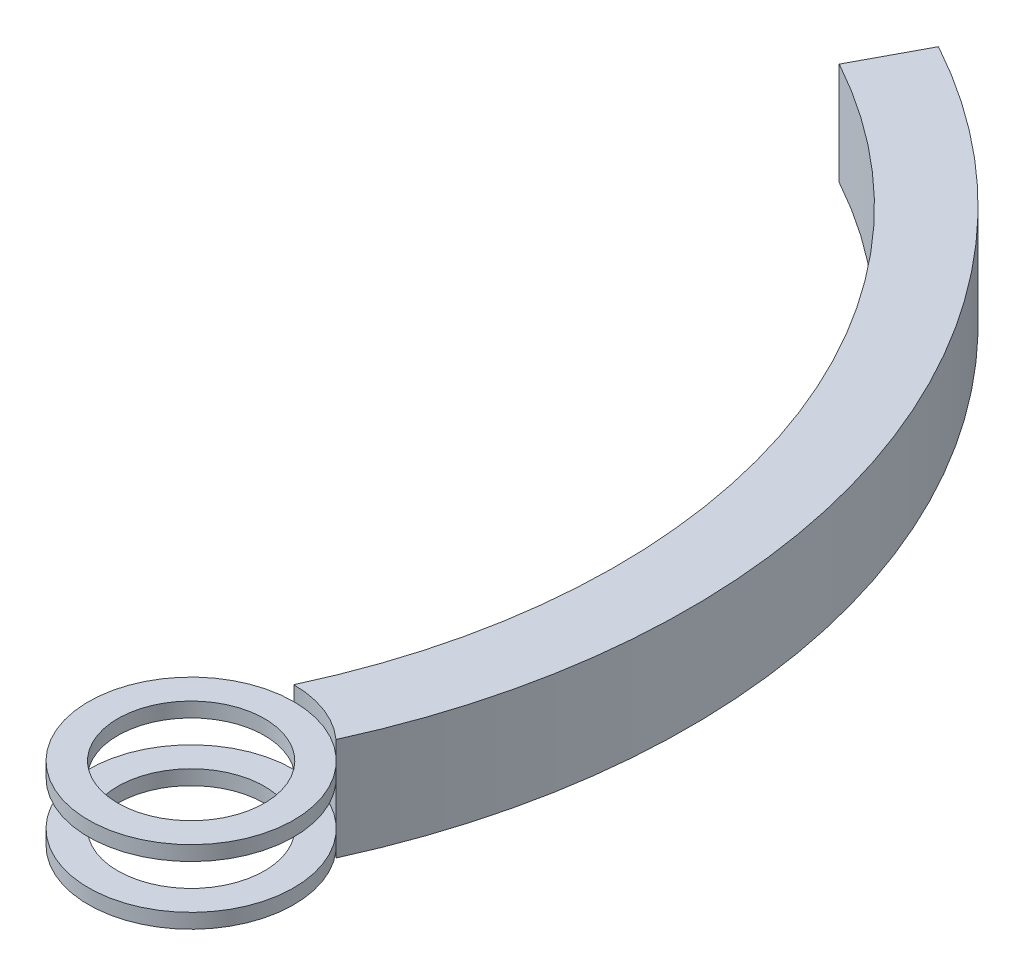
ISO-10303-21;
HEADER;
FILE_DESCRIPTION(('STEP AP214'),'2;1');
FILE_NAME('part.step','',(''),(''),'','','');
FILE_SCHEMA(('AUTOMOTIVE_DESIGN { 1 0 10303 214 1 1 1 1 }'));
ENDSEC;
DATA;
#1=APPLICATION_CONTEXT('core data for automotive mechanical design processes');
#2=APPLICATION_PROTOCOL_DEFINITION('international standard','automotive_design',2000,#1);
#3=PRODUCT_CONTEXT('',#1,'mechanical');
#4=PRODUCT('Part','Part','',(#3));
#5=PRODUCT_RELATED_PRODUCT_CATEGORY('part','',(#4));
#6=PRODUCT_DEFINITION_FORMATION('','',#4);
#7=PRODUCT_DEFINITION_CONTEXT('part definition',#1,'design');
#8=PRODUCT_DEFINITION('design','',#6,#7);
#9=PRODUCT_DEFINITION_SHAPE('','',#8);
#10=(LENGTH_UNIT() NAMED_UNIT(*) SI_UNIT(.MILLI.,.METRE.));
#11=(NAMED_UNIT(*) PLANE_ANGLE_UNIT() SI_UNIT($,.RADIAN.));
#12=(NAMED_UNIT(*) SI_UNIT($,.STERADIAN.) SOLID_ANGLE_UNIT());
#13=UNCERTAINTY_MEASURE_WITH_UNIT(LENGTH_MEASURE(1.E-05),#10,'distance_accuracy_value','');
#14=(GEOMETRIC_REPRESENTATION_CONTEXT(3) GLOBAL_UNCERTAINTY_ASSIGNED_CONTEXT((#13)) GLOBAL_UNIT_ASSIGNED_CONTEXT((#10,
#11,#12)) REPRESENTATION_CONTEXT('',''));
#15=CARTESIAN_POINT('',(0.,0.,0.));
#16=DIRECTION('',(0.,0.,1.));
#17=DIRECTION('',(1.,0.,0.));
#18=AXIS2_PLACEMENT_3D('',#15,#16,#17);
#19=CARTESIAN_POINT('',(9.42486588880634,215.9,-1430.31321434565));
#20=DIRECTION('',(0.,-1.,0.));
#21=DIRECTION('',(0.,0.,-1.));
#22=AXIS2_PLACEMENT_3D('',#19,#20,#21);
#23=CYLINDRICAL_SURFACE('',#22,76.2);
#24=CARTESIAN_POINT('',(9.42486588880634,150.585714285714,-1430.31321434565));
#25=DIRECTION('',(0.,-1.,0.));
#26=DIRECTION('',(0.,0.,-1.));
#27=AXIS2_PLACEMENT_3D('',#24,#25,#26);
#28=CIRCLE('',#27,76.2);
#29=CARTESIAN_POINT('',(60.3625796080155,150.585714285714,-1486.9858649018));
#30=VERTEX_POINT('',#29);
#31=CARTESIAN_POINT('',(9.42486588880628,150.585714285714,-1506.51321434565));
#32=VERTEX_POINT('',#31);
#33=EDGE_CURVE('E126',#30,#32,#28,.T.);
#34=ORIENTED_EDGE('',*,*,#33,.F.);
#35=DIRECTION('',(0.,-1.,0.));
#36=VECTOR('',#35,1.);
#37=CARTESIAN_POINT('',(60.3625796080155,215.9,-1486.9858649018));
#38=LINE('',#37,#36);
#39=CARTESIAN_POINT('',(60.3625796080155,161.471428571429,-1486.9858649018));
#40=VERTEX_POINT('',#39);
#41=EDGE_CURVE('E162',#40,#30,#38,.T.);
#42=ORIENTED_EDGE('',*,*,#41,.F.);
#43=CARTESIAN_POINT('',(9.42486588880634,161.471428571429,-1430.31321434565));
#44=DIRECTION('',(0.,1.,0.));
#45=DIRECTION('',(0.,0.,1.));
#46=AXIS2_PLACEMENT_3D('',#43,#44,#45);
#47=CIRCLE('',#46,76.2);
#48=CARTESIAN_POINT('',(9.42486588880628,161.471428571429,-1506.51321434565));
#49=VERTEX_POINT('',#48);
#50=EDGE_CURVE('E153',#49,#40,#47,.T.);
#51=ORIENTED_EDGE('',*,*,#50,.F.);
#52=DIRECTION('',(0.,-1.,0.));
#53=VECTOR('',#52,1.);
#54=CARTESIAN_POINT('',(9.42486588880631,215.9,-1506.51321434565));
#55=LINE('',#54,#53);
#56=EDGE_CURVE('E148',#49,#32,#55,.T.);
#57=ORIENTED_EDGE('',*,*,#56,.T.);
#58=EDGE_LOOP('',(#34,#42,#51,#57));
#59=FACE_BOUND('',#58,.T.);
#60=ADVANCED_FACE('F35',(#59),#23,.T.);
#61=CARTESIAN_POINT('',(9.42486588880631,205.014285714286,-1506.51321434565));
#62=VERTEX_POINT('',#61);
#63=CARTESIAN_POINT('',(9.42486588880631,194.128571428571,-1506.51321434565));
#64=VERTEX_POINT('',#63);
#65=EDGE_CURVE('E158',#62,#64,#55,.T.);
#66=ORIENTED_EDGE('',*,*,#65,.T.);
#67=CARTESIAN_POINT('',(9.42486588880634,194.128571428571,-1430.31321434565));
#68=DIRECTION('',(0.,1.,0.));
#69=DIRECTION('',(0.,0.,1.));
#70=AXIS2_PLACEMENT_3D('',#67,#68,#69);
#71=CIRCLE('',#70,76.2);
#72=CARTESIAN_POINT('',(60.3625796080155,194.128571428571,-1486.9858649018));
#73=VERTEX_POINT('',#72);
#74=EDGE_CURVE('E180',#64,#73,#71,.T.);
#75=ORIENTED_EDGE('',*,*,#74,.T.);
#76=CARTESIAN_POINT('',(60.3625796080155,205.014285714286,-1486.9858649018));
#77=VERTEX_POINT('',#76);
#78=EDGE_CURVE('E160',#77,#73,#38,.T.);
#79=ORIENTED_EDGE('',*,*,#78,.F.);
#80=CARTESIAN_POINT('',(9.42486588880634,205.014285714286,-1430.31321434565));
#81=DIRECTION('',(0.,1.,0.));
#82=DIRECTION('',(0.,0.,1.));
#83=AXIS2_PLACEMENT_3D('',#80,#81,#82);
#84=CIRCLE('',#83,76.2);
#85=EDGE_CURVE('E182',#62,#77,#84,.T.);
#86=ORIENTED_EDGE('',*,*,#85,.F.);
#87=EDGE_LOOP('',(#66,#75,#79,#86));
#88=FACE_BOUND('',#87,.T.);
#89=ADVANCED_FACE('F177',(#88),#23,.T.);
#90=CARTESIAN_POINT('',(-409.675134111194,215.9,-1702.45607148851));
#91=DIRECTION('',(0.,-1.,0.));
#92=DIRECTION('',(0.,0.,-1.));
#93=AXIS2_PLACEMENT_3D('',#90,#91,#92);
#94=CYLINDRICAL_SURFACE('',#93,517.071428571429);
#95=CARTESIAN_POINT('',(-409.675134111194,139.7,-1702.45607148851));
#96=DIRECTION('',(0.,1.,0.));
#97=DIRECTION('',(0.,0.,1.));
#98=AXIS2_PLACEMENT_3D('',#95,#96,#97);
#99=CIRCLE('',#98,517.071428571429);
#100=CARTESIAN_POINT('',(60.3625796080155,139.7,-1486.9858649018));
#101=VERTEX_POINT('',#100);
#102=CARTESIAN_POINT('',(-161.421062527572,139.7,-2156.03382467648));
#103=VERTEX_POINT('',#102);
#104=EDGE_CURVE('E203',#101,#103,#99,.T.);
#105=ORIENTED_EDGE('',*,*,#104,.T.);
#106=DIRECTION('',(0.,-1.,0.));
#107=VECTOR('',#106,1.);
#108=CARTESIAN_POINT('',(-161.421062527572,215.9,-2156.03382467648));
#109=LINE('',#108,#107);
#110=CARTESIAN_POINT('',(-161.421062527572,215.9,-2156.03382467648));
#111=VERTEX_POINT('',#110);
#112=EDGE_CURVE('E58',#103,#111,#109,.F.);
#113=ORIENTED_EDGE('',*,*,#112,.T.);
#114=CARTESIAN_POINT('',(-409.675134111194,215.9,-1702.45607148851));
#115=DIRECTION('',(0.,1.,0.));
#116=DIRECTION('',(0.,0.,1.));
#117=AXIS2_PLACEMENT_3D('',#114,#115,#116);
#118=CIRCLE('',#117,517.071428571429);
#119=CARTESIAN_POINT('',(60.3625796080155,215.9,-1486.9858649018));
#120=VERTEX_POINT('',#119);
#121=EDGE_CURVE('E205',#120,#111,#118,.T.);
#122=ORIENTED_EDGE('',*,*,#121,.F.);
#123=EDGE_CURVE('E155',#120,#77,#38,.T.);
#124=ORIENTED_EDGE('',*,*,#123,.T.);
#125=ORIENTED_EDGE('',*,*,#78,.T.);
#126=DIRECTION('',(0.,1.,0.));
#127=VECTOR('',#126,1.);
#128=CARTESIAN_POINT('',(60.3625796080155,177.8,-1486.9858649018));
#129=LINE('',#128,#127);
#130=EDGE_CURVE('E193',#73,#40,#129,.F.);
#131=ORIENTED_EDGE('',*,*,#130,.T.);
#132=ORIENTED_EDGE('',*,*,#41,.T.);
#133=DIRECTION('',(0.,-1.,0.));
#134=VECTOR('',#133,1.);
#135=CARTESIAN_POINT('',(60.3625796080155,145.142857142857,-1486.9858649018));
#136=LINE('',#135,#134);
#137=EDGE_CURVE('E143',#30,#101,#136,.T.);
#138=ORIENTED_EDGE('',*,*,#137,.T.);
#139=EDGE_LOOP('',(#105,#113,#122,#124,#125,#131,#132,#138));
#140=FACE_BOUND('',#139,.T.);
#141=ADVANCED_FACE('F211',(#140),#94,.T.);
#142=CARTESIAN_POINT('',(-191.960848396908,215.9,-2110.67035720279));
#143=DIRECTION('',(0.882352941176471,0.,0.470588235294117));
#144=DIRECTION('',(0.470588235294117,0.,-0.882352941176471));
#145=AXIS2_PLACEMENT_3D('',#142,#143,#144);
#146=PLANE('',#145);
#147=DIRECTION('',(0.,-1.,0.));
#148=VECTOR('',#147,1.);
#149=CARTESIAN_POINT('',(-168.938291654715,215.9,-2153.83765109441));
#150=LINE('',#149,#148);
#151=CARTESIAN_POINT('',(-168.938291654715,210.424359126444,-2153.83765109441));
#152=VERTEX_POINT('',#151);
#153=CARTESIAN_POINT('',(-168.938291654715,145.175640873556,-2153.83765109441));
#154=VERTEX_POINT('',#153);
#155=EDGE_CURVE('E260',#152,#154,#150,.T.);
#156=ORIENTED_EDGE('',*,*,#155,.T.);
#157=DIRECTION('',(-0.470588235294117,0.,0.882352941176471));
#158=VECTOR('',#157,1.);
#159=CARTESIAN_POINT('',(-191.960848396908,145.175640873556,-2110.67035720279));
#160=LINE('',#159,#158);
#161=CARTESIAN_POINT('',(-189.399503859093,145.175640873556,-2115.4728782112));
#162=VERTEX_POINT('',#161);
#163=EDGE_CURVE('E259',#154,#162,#160,.T.);
#164=ORIENTED_EDGE('',*,*,#163,.T.);
#165=DIRECTION('',(0.,1.,0.));
#166=VECTOR('',#165,1.);
#167=CARTESIAN_POINT('',(-189.399503859093,215.9,-2115.4728782112));
#168=LINE('',#167,#166);
#169=CARTESIAN_POINT('',(-189.399503859093,210.424359126444,-2115.4728782112));
#170=VERTEX_POINT('',#169);
#171=EDGE_CURVE('E164',#162,#170,#168,.T.);
#172=ORIENTED_EDGE('',*,*,#171,.T.);
#173=DIRECTION('',(0.470588235294117,0.,-0.882352941176471));
#174=VECTOR('',#173,1.);
#175=CARTESIAN_POINT('',(-166.347403018757,210.424359126444,-2158.69556728683));
#176=LINE('',#175,#174);
#177=EDGE_CURVE('E170',#170,#152,#176,.T.);
#178=ORIENTED_EDGE('',*,*,#177,.T.);
#179=EDGE_LOOP('',(#156,#164,#172,#178));
#180=FACE_BOUND('',#179,.T.);
#181=ADVANCED_FACE('F274',(#180),#146,.F.);
#182=CARTESIAN_POINT('',(-409.675134111194,215.9,-1702.45607148851));
#183=DIRECTION('',(0.,-1.,0.));
#184=DIRECTION('',(0.,0.,-1.));
#185=AXIS2_PLACEMENT_3D('',#182,#183,#184);
#186=CYLINDRICAL_SURFACE('',#185,462.642857142857);
#187=DIRECTION('',(0.,-1.,0.));
#188=VECTOR('',#187,1.);
#189=CARTESIAN_POINT('',(-187.144986106918,215.9,-2108.06517702548));
#190=LINE('',#189,#188);
#191=CARTESIAN_POINT('',(-187.144986106918,215.835950740885,-2108.06517702548));
#192=VERTEX_POINT('',#191);
#193=CARTESIAN_POINT('',(-187.144986106918,139.764049259115,-2108.06517702548));
#194=VERTEX_POINT('',#193);
#195=EDGE_CURVE('E263',#192,#194,#190,.T.);
#196=ORIENTED_EDGE('',*,*,#195,.T.);
#197=CARTESIAN_POINT('',(-409.675134111194,145.175640873556,-1702.45607148851));
#198=DIRECTION('',(0.620258500421887,0.711229747150414,0.330804533558339));
#199=DIRECTION('',(0.627555659250365,-0.702959633811472,0.334696351600194));
#200=AXIS2_PLACEMENT_3D('',#197,#198,#199);
#201=ELLIPSE('',#200,650.482996523225,462.642857142857);
#202=CARTESIAN_POINT('',(-187.088170250446,139.7,-2108.03400084927));
#203=VERTEX_POINT('',#202);
#204=EDGE_CURVE('E256',#194,#203,#201,.F.);
#205=ORIENTED_EDGE('',*,*,#204,.T.);
#206=CARTESIAN_POINT('',(-409.675134111194,139.7,-1702.45607148851));
#207=DIRECTION('',(0.,-1.,0.));
#208=DIRECTION('',(0.,0.,1.));
#209=AXIS2_PLACEMENT_3D('',#206,#207,#208);
#210=CIRCLE('',#209,462.642857142857);
#211=CARTESIAN_POINT('',(9.42486588880631,139.7,-1506.51321434565));
#212=VERTEX_POINT('',#211);
#213=EDGE_CURVE('E150',#203,#212,#210,.T.);
#214=ORIENTED_EDGE('',*,*,#213,.T.);
#215=DIRECTION('',(0.,-1.,0.));
#216=VECTOR('',#215,1.);
#217=CARTESIAN_POINT('',(9.42486588880629,145.142857142857,-1506.51321434565));
#218=LINE('',#217,#216);
#219=EDGE_CURVE('E140',#212,#32,#218,.F.);
#220=ORIENTED_EDGE('',*,*,#219,.T.);
#221=ORIENTED_EDGE('',*,*,#56,.F.);
#222=EDGE_CURVE('E154',#64,#49,#55,.T.);
#223=ORIENTED_EDGE('',*,*,#222,.F.);
#224=ORIENTED_EDGE('',*,*,#65,.F.);
#225=CARTESIAN_POINT('',(9.42486588880629,215.9,-1506.51321434565));
#226=VERTEX_POINT('',#225);
#227=EDGE_CURVE('E157',#226,#62,#55,.T.);
#228=ORIENTED_EDGE('',*,*,#227,.F.);
#229=CARTESIAN_POINT('',(-409.675134111194,215.9,-1702.45607148851));
#230=DIRECTION('',(0.,-1.,0.));
#231=DIRECTION('',(0.,0.,1.));
#232=AXIS2_PLACEMENT_3D('',#229,#230,#231);
#233=CIRCLE('',#232,462.642857142857);
#234=CARTESIAN_POINT('',(-187.088170250446,215.9,-2108.03400084927));
#235=VERTEX_POINT('',#234);
#236=EDGE_CURVE('E207',#235,#226,#233,.T.);
#237=ORIENTED_EDGE('',*,*,#236,.F.);
#238=CARTESIAN_POINT('',(-409.675134111194,210.424359126444,-1702.45607148851));
#239=DIRECTION('',(-0.620258500421887,0.711229747150414,-0.330804533558339));
#240=DIRECTION('',(-0.627555659250365,-0.702959633811472,-0.334696351600194));
#241=AXIS2_PLACEMENT_3D('',#238,#239,#240);
#242=ELLIPSE('',#241,650.482996523225,462.642857142857);
#243=EDGE_CURVE('E268',#235,#192,#242,.T.);
#244=ORIENTED_EDGE('',*,*,#243,.T.);
#245=EDGE_LOOP('',(#196,#205,#214,#220,#221,#223,#224,#228,#237,#244));
#246=FACE_BOUND('',#245,.T.);
#247=ADVANCED_FACE('F146',(#246),#186,.F.);
#248=CARTESIAN_POINT('',(-409.675134111194,215.9,-1702.45607148851));
#249=DIRECTION('',(0.,1.,0.));
#250=DIRECTION('',(0.,0.,1.));
#251=AXIS2_PLACEMENT_3D('',#248,#249,#250);
#252=PLANE('',#251);
#253=ORIENTED_EDGE('',*,*,#121,.T.);
#254=DIRECTION('',(0.959874679050193,0.,-0.280429314655744));
#255=VECTOR('',#254,1.);
#256=CARTESIAN_POINT('',(-512.244982985559,215.9,-2053.53991195423));
#257=LINE('',#256,#255);
#258=CARTESIAN_POINT('',(-161.500667867937,215.9,-2156.01056781647));
#259=VERTEX_POINT('',#258);
#260=EDGE_CURVE('E11',#111,#259,#257,.F.);
#261=ORIENTED_EDGE('',*,*,#260,.T.);
#262=DIRECTION('',(-0.470588235294117,0.,0.882352941176471));
#263=VECTOR('',#262,1.);
#264=CARTESIAN_POINT('',(-187.072560004599,215.9,-2108.06327006023));
#265=LINE('',#264,#263);
#266=EDGE_CURVE('E44',#259,#235,#265,.T.);
#267=ORIENTED_EDGE('',*,*,#266,.T.);
#268=ORIENTED_EDGE('',*,*,#236,.T.);
#269=CARTESIAN_POINT('',(9.42486588880634,215.9,-1430.31321434565));
#270=DIRECTION('',(0.,1.,0.));
#271=DIRECTION('',(0.,0.,1.));
#272=AXIS2_PLACEMENT_3D('',#269,#270,#271);
#273=CIRCLE('',#272,76.2);
#274=EDGE_CURVE('E196',#120,#226,#273,.T.);
#275=ORIENTED_EDGE('',*,*,#274,.F.);
#276=EDGE_LOOP('',(#253,#261,#267,#268,#275));
#277=FACE_BOUND('',#276,.T.);
#278=ADVANCED_FACE('F281',(#277),#252,.T.);
#279=CARTESIAN_POINT('',(-409.675134111194,139.7,-1702.45607148851));
#280=DIRECTION('',(0.,1.,0.));
#281=DIRECTION('',(0.,0.,1.));
#282=AXIS2_PLACEMENT_3D('',#279,#280,#281);
#283=PLANE('',#282);
#284=ORIENTED_EDGE('',*,*,#213,.F.);
#285=DIRECTION('',(0.470588235294117,0.,-0.882352941176471));
#286=VECTOR('',#285,1.);
#287=CARTESIAN_POINT('',(-404.786845718884,139.7,-1699.84898434594));
#288=LINE('',#287,#286);
#289=CARTESIAN_POINT('',(-161.500667867937,139.7,-2156.01056781647));
#290=VERTEX_POINT('',#289);
#291=EDGE_CURVE('E220',#203,#290,#288,.T.);
#292=ORIENTED_EDGE('',*,*,#291,.T.);
#293=DIRECTION('',(-0.959874679050193,0.,0.280429314655744));
#294=VECTOR('',#293,1.);
#295=CARTESIAN_POINT('',(-168.938291654715,139.7,-2153.83765109441));
#296=LINE('',#295,#294);
#297=EDGE_CURVE('E217',#290,#103,#296,.F.);
#298=ORIENTED_EDGE('',*,*,#297,.T.);
#299=ORIENTED_EDGE('',*,*,#104,.F.);
#300=CARTESIAN_POINT('',(9.42486588880634,139.7,-1430.31321434565));
#301=DIRECTION('',(0.,-1.,0.));
#302=DIRECTION('',(0.,0.,-1.));
#303=AXIS2_PLACEMENT_3D('',#300,#301,#302);
#304=CIRCLE('',#303,76.2);
#305=EDGE_CURVE('E134',#212,#101,#304,.T.);
#306=ORIENTED_EDGE('',*,*,#305,.F.);
#307=EDGE_LOOP('',(#284,#292,#298,#299,#306));
#308=FACE_BOUND('',#307,.T.);
#309=ADVANCED_FACE('F251',(#308),#283,.F.);
#310=CARTESIAN_POINT('',(9.42486588880634,205.014285714286,-1430.31321434565));
#311=DIRECTION('',(0.,1.,0.));
#312=DIRECTION('',(0.,0.,1.));
#313=AXIS2_PLACEMENT_3D('',#310,#311,#312);
#314=CYLINDRICAL_SURFACE('',#313,76.2);
#315=ORIENTED_EDGE('',*,*,#274,.T.);
#316=ORIENTED_EDGE('',*,*,#227,.T.);
#317=EDGE_CURVE('E201',#77,#62,#84,.T.);
#318=ORIENTED_EDGE('',*,*,#317,.F.);
#319=ORIENTED_EDGE('',*,*,#123,.F.);
#320=EDGE_LOOP('',(#315,#316,#318,#319));
#321=FACE_BOUND('',#320,.T.);
#322=ADVANCED_FACE('F292',(#321),#314,.F.);
#323=CARTESIAN_POINT('',(9.42486588880634,205.014285714286,-1430.31321434565));
#324=DIRECTION('',(0.,1.,0.));
#325=DIRECTION('',(0.,0.,1.));
#326=AXIS2_PLACEMENT_3D('',#323,#324,#325);
#327=PLANE('',#326);
#328=CARTESIAN_POINT('',(9.42486588880634,205.014285714286,-1430.31321434565));
#329=DIRECTION('',(0.,1.,0.));
#330=DIRECTION('',(0.,0.,1.));
#331=AXIS2_PLACEMENT_3D('',#328,#329,#330);
#332=CIRCLE('',#331,54.4285714285714);
#333=CARTESIAN_POINT('',(9.42486588880634,205.014285714286,-1375.88464291708));
#334=VERTEX_POINT('',#333);
#335=EDGE_CURVE('E235',#334,#334,#332,.T.);
#336=ORIENTED_EDGE('',*,*,#335,.F.);
#337=EDGE_LOOP('',(#336));
#338=FACE_BOUND('',#337,.T.);
#339=ORIENTED_EDGE('',*,*,#317,.T.);
#340=ORIENTED_EDGE('',*,*,#85,.T.);
#341=EDGE_LOOP('',(#339,#340));
#342=FACE_BOUND('',#341,.T.);
#343=ADVANCED_FACE('F297',(#338,#342),#327,.T.);
#344=CARTESIAN_POINT('',(9.42486588880634,161.471428571429,-1430.31321434565));
#345=DIRECTION('',(0.,1.,0.));
#346=DIRECTION('',(0.,0.,1.));
#347=AXIS2_PLACEMENT_3D('',#344,#345,#346);
#348=CYLINDRICAL_SURFACE('',#347,76.2);
#349=EDGE_CURVE('E190',#73,#64,#71,.T.);
#350=ORIENTED_EDGE('',*,*,#349,.T.);
#351=ORIENTED_EDGE('',*,*,#222,.T.);
#352=EDGE_CURVE('E188',#40,#49,#47,.T.);
#353=ORIENTED_EDGE('',*,*,#352,.F.);
#354=ORIENTED_EDGE('',*,*,#130,.F.);
#355=EDGE_LOOP('',(#350,#351,#353,#354));
#356=FACE_BOUND('',#355,.T.);
#357=ADVANCED_FACE('F187',(#356),#348,.F.);
#358=CARTESIAN_POINT('',(9.42486588880634,161.471428571429,-1430.31321434565));
#359=DIRECTION('',(0.,1.,0.));
#360=DIRECTION('',(0.,0.,1.));
#361=AXIS2_PLACEMENT_3D('',#358,#359,#360);
#362=PLANE('',#361);
#363=CARTESIAN_POINT('',(9.42486588880634,161.471428571429,-1430.31321434565));
#364=DIRECTION('',(0.,1.,0.));
#365=DIRECTION('',(0.,0.,1.));
#366=AXIS2_PLACEMENT_3D('',#363,#364,#365);
#367=CIRCLE('',#366,54.4285714285714);
#368=CARTESIAN_POINT('',(9.42486588880634,161.471428571429,-1375.88464291708));
#369=VERTEX_POINT('',#368);
#370=EDGE_CURVE('E248',#369,#369,#367,.T.);
#371=ORIENTED_EDGE('',*,*,#370,.F.);
#372=EDGE_LOOP('',(#371));
#373=FACE_BOUND('',#372,.T.);
#374=ORIENTED_EDGE('',*,*,#352,.T.);
#375=ORIENTED_EDGE('',*,*,#50,.T.);
#376=EDGE_LOOP('',(#374,#375));
#377=FACE_BOUND('',#376,.T.);
#378=ADVANCED_FACE('F192',(#373,#377),#362,.T.);
#379=CARTESIAN_POINT('',(9.42486588880634,194.128571428571,-1430.31321434565));
#380=DIRECTION('',(0.,1.,0.));
#381=DIRECTION('',(0.,0.,1.));
#382=AXIS2_PLACEMENT_3D('',#379,#380,#381);
#383=PLANE('',#382);
#384=CARTESIAN_POINT('',(9.42486588880634,194.128571428571,-1430.31321434565));
#385=DIRECTION('',(0.,1.,0.));
#386=DIRECTION('',(0.,0.,1.));
#387=AXIS2_PLACEMENT_3D('',#384,#385,#386);
#388=CIRCLE('',#387,54.4285714285714);
#389=CARTESIAN_POINT('',(9.42486588880634,194.128571428571,-1375.88464291708));
#390=VERTEX_POINT('',#389);
#391=EDGE_CURVE('E244',#390,#390,#388,.T.);
#392=ORIENTED_EDGE('',*,*,#391,.T.);
#393=EDGE_LOOP('',(#392));
#394=FACE_BOUND('',#393,.T.);
#395=ORIENTED_EDGE('',*,*,#349,.F.);
#396=ORIENTED_EDGE('',*,*,#74,.F.);
#397=EDGE_LOOP('',(#395,#396));
#398=FACE_BOUND('',#397,.T.);
#399=ADVANCED_FACE('F303',(#394,#398),#383,.F.);
#400=CARTESIAN_POINT('',(9.42486588880634,150.585714285714,-1430.31321434565));
#401=DIRECTION('',(0.,-1.,0.));
#402=DIRECTION('',(0.,0.,-1.));
#403=AXIS2_PLACEMENT_3D('',#400,#401,#402);
#404=CYLINDRICAL_SURFACE('',#403,76.2);
#405=EDGE_CURVE('E129',#32,#30,#28,.T.);
#406=ORIENTED_EDGE('',*,*,#405,.F.);
#407=ORIENTED_EDGE('',*,*,#219,.F.);
#408=ORIENTED_EDGE('',*,*,#305,.T.);
#409=ORIENTED_EDGE('',*,*,#137,.F.);
#410=EDGE_LOOP('',(#406,#407,#408,#409));
#411=FACE_BOUND('',#410,.T.);
#412=ADVANCED_FACE('F139',(#411),#404,.F.);
#413=CARTESIAN_POINT('',(9.42486588880634,150.585714285714,-1430.31321434565));
#414=DIRECTION('',(0.,-1.,0.));
#415=DIRECTION('',(0.,0.,-1.));
#416=AXIS2_PLACEMENT_3D('',#413,#414,#415);
#417=PLANE('',#416);
#418=CARTESIAN_POINT('',(9.42486588880634,150.585714285714,-1430.31321434565));
#419=DIRECTION('',(0.,-1.,0.));
#420=DIRECTION('',(0.,0.,-1.));
#421=AXIS2_PLACEMENT_3D('',#418,#419,#420);
#422=CIRCLE('',#421,54.4285714285714);
#423=CARTESIAN_POINT('',(9.42486588880634,150.585714285714,-1484.74178577422));
#424=VERTEX_POINT('',#423);
#425=EDGE_CURVE('E239',#424,#424,#422,.T.);
#426=ORIENTED_EDGE('',*,*,#425,.F.);
#427=EDGE_LOOP('',(#426));
#428=FACE_BOUND('',#427,.T.);
#429=ORIENTED_EDGE('',*,*,#405,.T.);
#430=ORIENTED_EDGE('',*,*,#33,.T.);
#431=EDGE_LOOP('',(#429,#430));
#432=FACE_BOUND('',#431,.T.);
#433=ADVANCED_FACE('F128',(#428,#432),#417,.T.);
#434=CARTESIAN_POINT('',(9.42486588880634,52.6142857142857,-1430.31321434565));
#435=DIRECTION('',(0.,1.,0.));
#436=DIRECTION('',(0.,0.,1.));
#437=AXIS2_PLACEMENT_3D('',#434,#435,#436);
#438=CYLINDRICAL_SURFACE('',#437,54.4285714285714);
#439=ORIENTED_EDGE('',*,*,#370,.T.);
#440=EDGE_LOOP('',(#439));
#441=FACE_BOUND('',#440,.T.);
#442=ORIENTED_EDGE('',*,*,#425,.T.);
#443=EDGE_LOOP('',(#442));
#444=FACE_BOUND('',#443,.T.);
#445=ADVANCED_FACE('F314',(#441,#444),#438,.F.);
#446=ORIENTED_EDGE('',*,*,#335,.T.);
#447=EDGE_LOOP('',(#446));
#448=FACE_BOUND('',#447,.T.);
#449=ORIENTED_EDGE('',*,*,#391,.F.);
#450=EDGE_LOOP('',(#449));
#451=FACE_BOUND('',#450,.T.);
#452=ADVANCED_FACE('F317',(#448,#451),#438,.F.);
#453=CARTESIAN_POINT('',(-404.786845718884,215.9,-1699.84898434594));
#454=DIRECTION('',(-0.620258500421887,0.711229747150414,-0.330804533558339));
#455=DIRECTION('',(0.470588235294117,0.,-0.882352941176471));
#456=AXIS2_PLACEMENT_3D('',#453,#454,#455);
#457=PLANE('',#456);
#458=ORIENTED_EDGE('',*,*,#243,.F.);
#459=ORIENTED_EDGE('',*,*,#266,.F.);
#460=DIRECTION('',(0.783896588312206,0.577111228351461,-0.229016962129775));
#461=VECTOR('',#460,1.);
#462=CARTESIAN_POINT('',(-392.891219603513,45.5483394211995,-2088.40935355668));
#463=LINE('',#462,#461);
#464=EDGE_CURVE('E39',#152,#259,#463,.T.);
#465=ORIENTED_EDGE('',*,*,#464,.F.);
#466=ORIENTED_EDGE('',*,*,#177,.F.);
#467=DIRECTION('',(0.238653879567994,0.572848597966377,0.784148461437694));
#468=VECTOR('',#467,1.);
#469=CARTESIAN_POINT('',(-187.136229769999,215.856968858571,-2108.03640620417));
#470=LINE('',#469,#468);
#471=EDGE_CURVE('E229',#192,#170,#470,.F.);
#472=ORIENTED_EDGE('',*,*,#471,.F.);
#473=EDGE_LOOP('',(#458,#459,#465,#466,#472));
#474=FACE_BOUND('',#473,.T.);
#475=ADVANCED_FACE('F37',(#474),#457,.T.);
#476=CARTESIAN_POINT('',(-168.938291654715,215.9,-2153.83765109441));
#477=DIRECTION('',(0.280429314655744,0.,0.959874679050192));
#478=DIRECTION('',(0.,-1.,0.));
#479=AXIS2_PLACEMENT_3D('',#476,#477,#478);
#480=PLANE('',#479);
#481=ORIENTED_EDGE('',*,*,#112,.F.);
#482=ORIENTED_EDGE('',*,*,#297,.F.);
#483=DIRECTION('',(-0.783896588312206,0.577111228351461,0.229016962129775));
#484=VECTOR('',#483,1.);
#485=CARTESIAN_POINT('',(-200.933675089245,168.730909911318,-2144.49013558585));
#486=LINE('',#485,#484);
#487=EDGE_CURVE('E228',#154,#290,#486,.F.);
#488=ORIENTED_EDGE('',*,*,#487,.F.);
#489=ORIENTED_EDGE('',*,*,#155,.F.);
#490=ORIENTED_EDGE('',*,*,#464,.T.);
#491=ORIENTED_EDGE('',*,*,#260,.F.);
#492=EDGE_LOOP('',(#481,#482,#488,#489,#490,#491));
#493=FACE_BOUND('',#492,.T.);
#494=ADVANCED_FACE('F215',(#493),#480,.F.);
#495=CARTESIAN_POINT('',(-187.144986106918,215.9,-2108.06517702548));
#496=DIRECTION('',(0.956673880428858,0.,-0.291161615782696));
#497=DIRECTION('',(0.,-1.,0.));
#498=AXIS2_PLACEMENT_3D('',#495,#496,#497);
#499=PLANE('',#498);
#500=ORIENTED_EDGE('',*,*,#471,.T.);
#501=ORIENTED_EDGE('',*,*,#171,.F.);
#502=DIRECTION('',(0.238653879567994,-0.572848597966377,0.784148461437694));
#503=VECTOR('',#502,1.);
#504=CARTESIAN_POINT('',(-197.553725341603,164.748481475262,-2142.26532022516));
#505=LINE('',#504,#503);
#506=EDGE_CURVE('E226',#194,#162,#505,.F.);
#507=ORIENTED_EDGE('',*,*,#506,.F.);
#508=ORIENTED_EDGE('',*,*,#195,.F.);
#509=EDGE_LOOP('',(#500,#501,#507,#508));
#510=FACE_BOUND('',#509,.T.);
#511=ADVANCED_FACE('F272',(#510),#499,.F.);
#512=CARTESIAN_POINT('',(-191.960848396908,145.175640873556,-2110.67035720279));
#513=DIRECTION('',(0.620258500421887,0.711229747150414,0.330804533558339));
#514=DIRECTION('',(-0.470588235294117,0.,0.882352941176471));
#515=AXIS2_PLACEMENT_3D('',#512,#513,#514);
#516=PLANE('',#515);
#517=ORIENTED_EDGE('',*,*,#487,.T.);
#518=ORIENTED_EDGE('',*,*,#291,.F.);
#519=ORIENTED_EDGE('',*,*,#204,.F.);
#520=ORIENTED_EDGE('',*,*,#506,.T.);
#521=ORIENTED_EDGE('',*,*,#163,.F.);
#522=EDGE_LOOP('',(#517,#518,#519,#520,#521));
#523=FACE_BOUND('',#522,.T.);
#524=ADVANCED_FACE('F255',(#523),#516,.F.);
#525=CLOSED_SHELL('',(#60,#89,#141,#181,#247,#278,#309,#322,#343,#357,#378,#399,#412,#433,#445,
#452,#475,#494,#511,#524));
#526=MANIFOLD_SOLID_BREP('B2',#525);
#527=ADVANCED_BREP_SHAPE_REPRESENTATION('',(#18,#526),#14);
#528=SHAPE_DEFINITION_REPRESENTATION(#9,#527);
ENDSEC;
END-ISO-10303-21;
